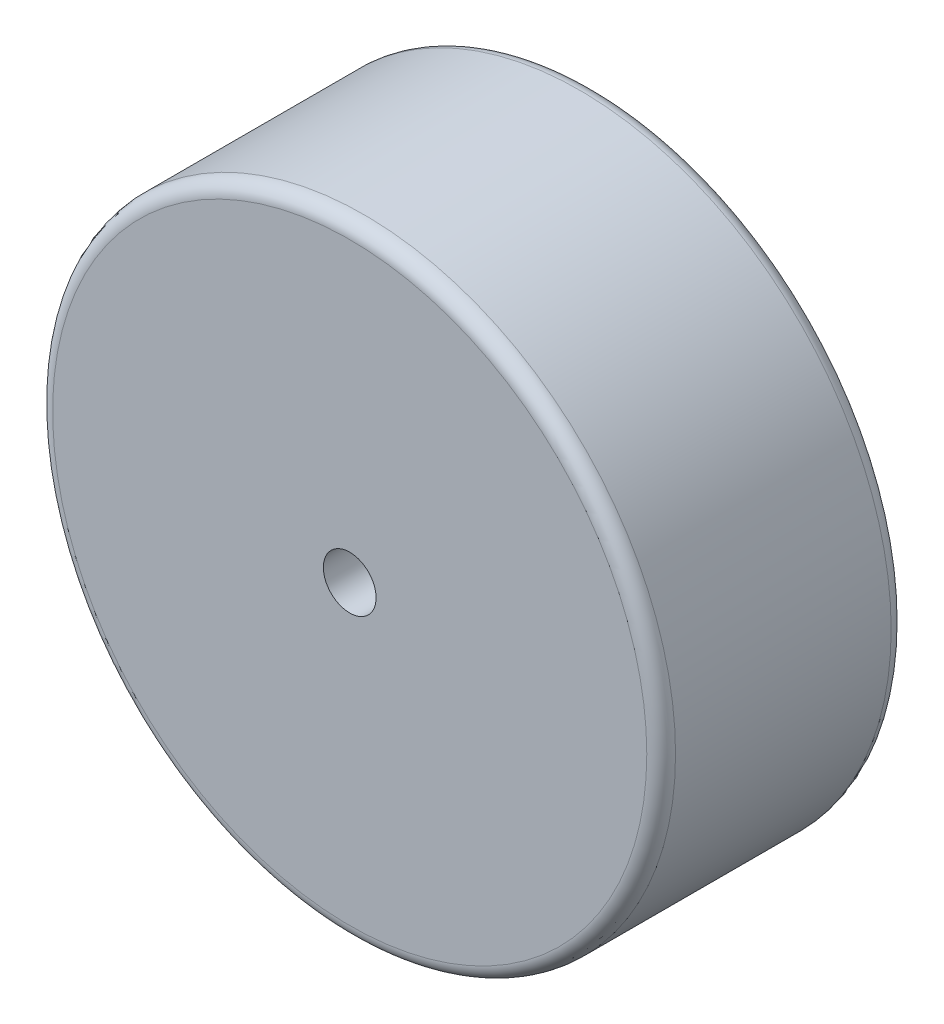
ISO-10303-21;
HEADER;
FILE_DESCRIPTION(('STEP AP214'),'2;1');
FILE_NAME('part.step','',(''),(''),'','','');
FILE_SCHEMA(('AUTOMOTIVE_DESIGN { 1 0 10303 214 1 1 1 1 }'));
ENDSEC;
DATA;
#1=APPLICATION_CONTEXT('core data for automotive mechanical design processes');
#2=APPLICATION_PROTOCOL_DEFINITION('international standard','automotive_design',2000,#1);
#3=PRODUCT_CONTEXT('',#1,'mechanical');
#4=PRODUCT('Part','Part','',(#3));
#5=PRODUCT_RELATED_PRODUCT_CATEGORY('part','',(#4));
#6=PRODUCT_DEFINITION_FORMATION('','',#4);
#7=PRODUCT_DEFINITION_CONTEXT('part definition',#1,'design');
#8=PRODUCT_DEFINITION('design','',#6,#7);
#9=PRODUCT_DEFINITION_SHAPE('','',#8);
#10=(LENGTH_UNIT() NAMED_UNIT(*) SI_UNIT(.MILLI.,.METRE.));
#11=(NAMED_UNIT(*) PLANE_ANGLE_UNIT() SI_UNIT($,.RADIAN.));
#12=(NAMED_UNIT(*) SI_UNIT($,.STERADIAN.) SOLID_ANGLE_UNIT());
#13=UNCERTAINTY_MEASURE_WITH_UNIT(LENGTH_MEASURE(1.E-05),#10,'distance_accuracy_value','');
#14=(GEOMETRIC_REPRESENTATION_CONTEXT(3) GLOBAL_UNCERTAINTY_ASSIGNED_CONTEXT((#13)) GLOBAL_UNIT_ASSIGNED_CONTEXT((#10,
#11,#12)) REPRESENTATION_CONTEXT('',''));
#15=CARTESIAN_POINT('',(0.,0.,0.));
#16=DIRECTION('',(0.,0.,1.));
#17=DIRECTION('',(1.,0.,0.));
#18=AXIS2_PLACEMENT_3D('',#15,#16,#17);
#19=CARTESIAN_POINT('',(0.,0.,51.));
#20=DIRECTION('',(0.,0.,-1.));
#21=DIRECTION('',(-1.,0.,0.));
#22=AXIS2_PLACEMENT_3D('',#19,#20,#21);
#23=CYLINDRICAL_SURFACE('',#22,65.);
#24=CARTESIAN_POINT('',(0.,0.,48.));
#25=DIRECTION('',(0.,0.,1.));
#26=DIRECTION('',(1.,0.,0.));
#27=AXIS2_PLACEMENT_3D('',#24,#25,#26);
#28=CIRCLE('',#27,65.);
#29=CARTESIAN_POINT('',(65.,0.,48.));
#30=VERTEX_POINT('',#29);
#31=EDGE_CURVE('E42',#30,#30,#28,.F.);
#32=ORIENTED_EDGE('',*,*,#31,.T.);
#33=EDGE_LOOP('',(#32));
#34=FACE_BOUND('',#33,.T.);
#35=CARTESIAN_POINT('',(0.,0.,3.));
#36=DIRECTION('',(0.,0.,1.));
#37=DIRECTION('',(1.,0.,0.));
#38=AXIS2_PLACEMENT_3D('',#35,#36,#37);
#39=CIRCLE('',#38,65.);
#40=CARTESIAN_POINT('',(65.,0.,3.));
#41=VERTEX_POINT('',#40);
#42=EDGE_CURVE('E46',#41,#41,#39,.T.);
#43=ORIENTED_EDGE('',*,*,#42,.T.);
#44=EDGE_LOOP('',(#43));
#45=FACE_BOUND('',#44,.T.);
#46=ADVANCED_FACE('F35',(#34,#45),#23,.T.);
#47=CARTESIAN_POINT('',(0.,0.,51.));
#48=DIRECTION('',(0.,0.,1.));
#49=DIRECTION('',(1.,0.,0.));
#50=AXIS2_PLACEMENT_3D('',#47,#48,#49);
#51=PLANE('',#50);
#52=CARTESIAN_POINT('',(0.,0.,51.));
#53=DIRECTION('',(0.,0.,1.));
#54=DIRECTION('',(1.,0.,0.));
#55=AXIS2_PLACEMENT_3D('',#52,#53,#54);
#56=CIRCLE('',#55,62.);
#57=CARTESIAN_POINT('',(62.,0.,51.));
#58=VERTEX_POINT('',#57);
#59=EDGE_CURVE('E50',#58,#58,#56,.T.);
#60=ORIENTED_EDGE('',*,*,#59,.T.);
#61=EDGE_LOOP('',(#60));
#62=FACE_BOUND('',#61,.T.);
#63=CARTESIAN_POINT('',(0.,0.,51.));
#64=DIRECTION('',(0.,0.,1.));
#65=DIRECTION('',(1.,0.,0.));
#66=AXIS2_PLACEMENT_3D('',#63,#64,#65);
#67=CIRCLE('',#66,5.5);
#68=CARTESIAN_POINT('',(5.5,0.,51.));
#69=VERTEX_POINT('',#68);
#70=EDGE_CURVE('E56',#69,#69,#67,.T.);
#71=ORIENTED_EDGE('',*,*,#70,.F.);
#72=EDGE_LOOP('',(#71));
#73=FACE_BOUND('',#72,.T.);
#74=ADVANCED_FACE('F71',(#62,#73),#51,.T.);
#75=CARTESIAN_POINT('',(0.,0.,0.));
#76=DIRECTION('',(0.,0.,1.));
#77=DIRECTION('',(1.,0.,0.));
#78=AXIS2_PLACEMENT_3D('',#75,#76,#77);
#79=PLANE('',#78);
#80=CARTESIAN_POINT('',(0.,0.,0.));
#81=DIRECTION('',(0.,0.,1.));
#82=DIRECTION('',(1.,0.,0.));
#83=AXIS2_PLACEMENT_3D('',#80,#81,#82);
#84=CIRCLE('',#83,62.);
#85=CARTESIAN_POINT('',(62.,0.,0.));
#86=VERTEX_POINT('',#85);
#87=EDGE_CURVE('E10',#86,#86,#84,.F.);
#88=ORIENTED_EDGE('',*,*,#87,.T.);
#89=EDGE_LOOP('',(#88));
#90=FACE_BOUND('',#89,.T.);
#91=CARTESIAN_POINT('',(0.,0.,0.));
#92=DIRECTION('',(0.,0.,1.));
#93=DIRECTION('',(1.,0.,0.));
#94=AXIS2_PLACEMENT_3D('',#91,#92,#93);
#95=CIRCLE('',#94,5.5);
#96=CARTESIAN_POINT('',(5.5,0.,0.));
#97=VERTEX_POINT('',#96);
#98=EDGE_CURVE('E55',#97,#97,#95,.T.);
#99=ORIENTED_EDGE('',*,*,#98,.T.);
#100=EDGE_LOOP('',(#99));
#101=FACE_BOUND('',#100,.T.);
#102=ADVANCED_FACE('F62',(#90,#101),#79,.F.);
#103=CARTESIAN_POINT('',(0.,0.,0.));
#104=DIRECTION('',(0.,0.,1.));
#105=DIRECTION('',(1.,0.,0.));
#106=AXIS2_PLACEMENT_3D('',#103,#104,#105);
#107=CYLINDRICAL_SURFACE('',#106,5.5);
#108=ORIENTED_EDGE('',*,*,#98,.F.);
#109=EDGE_LOOP('',(#108));
#110=FACE_BOUND('',#109,.T.);
#111=ORIENTED_EDGE('',*,*,#70,.T.);
#112=EDGE_LOOP('',(#111));
#113=FACE_BOUND('',#112,.T.);
#114=ADVANCED_FACE('F64',(#110,#113),#107,.F.);
#115=CARTESIAN_POINT('',(0.,0.,48.));
#116=DIRECTION('',(0.,0.,1.));
#117=DIRECTION('',(1.,0.,0.));
#118=AXIS2_PLACEMENT_3D('',#115,#116,#117);
#119=TOROIDAL_SURFACE('',#118,62.,3.);
#120=ORIENTED_EDGE('',*,*,#31,.F.);
#121=EDGE_LOOP('',(#120));
#122=FACE_BOUND('',#121,.T.);
#123=ORIENTED_EDGE('',*,*,#59,.F.);
#124=EDGE_LOOP('',(#123));
#125=FACE_BOUND('',#124,.T.);
#126=ADVANCED_FACE('F67',(#122,#125),#119,.T.);
#127=CARTESIAN_POINT('',(0.,0.,3.));
#128=DIRECTION('',(0.,0.,1.));
#129=DIRECTION('',(1.,0.,0.));
#130=AXIS2_PLACEMENT_3D('',#127,#128,#129);
#131=TOROIDAL_SURFACE('',#130,62.,3.);
#132=ORIENTED_EDGE('',*,*,#87,.F.);
#133=EDGE_LOOP('',(#132));
#134=FACE_BOUND('',#133,.T.);
#135=ORIENTED_EDGE('',*,*,#42,.F.);
#136=EDGE_LOOP('',(#135));
#137=FACE_BOUND('',#136,.T.);
#138=ADVANCED_FACE('F37',(#134,#137),#131,.T.);
#139=CLOSED_SHELL('',(#46,#74,#102,#114,#126,#138));
#140=MANIFOLD_SOLID_BREP('B2',#139);
#141=ADVANCED_BREP_SHAPE_REPRESENTATION('',(#18,#140),#14);
#142=SHAPE_DEFINITION_REPRESENTATION(#9,#141);
ENDSEC;
END-ISO-10303-21;
